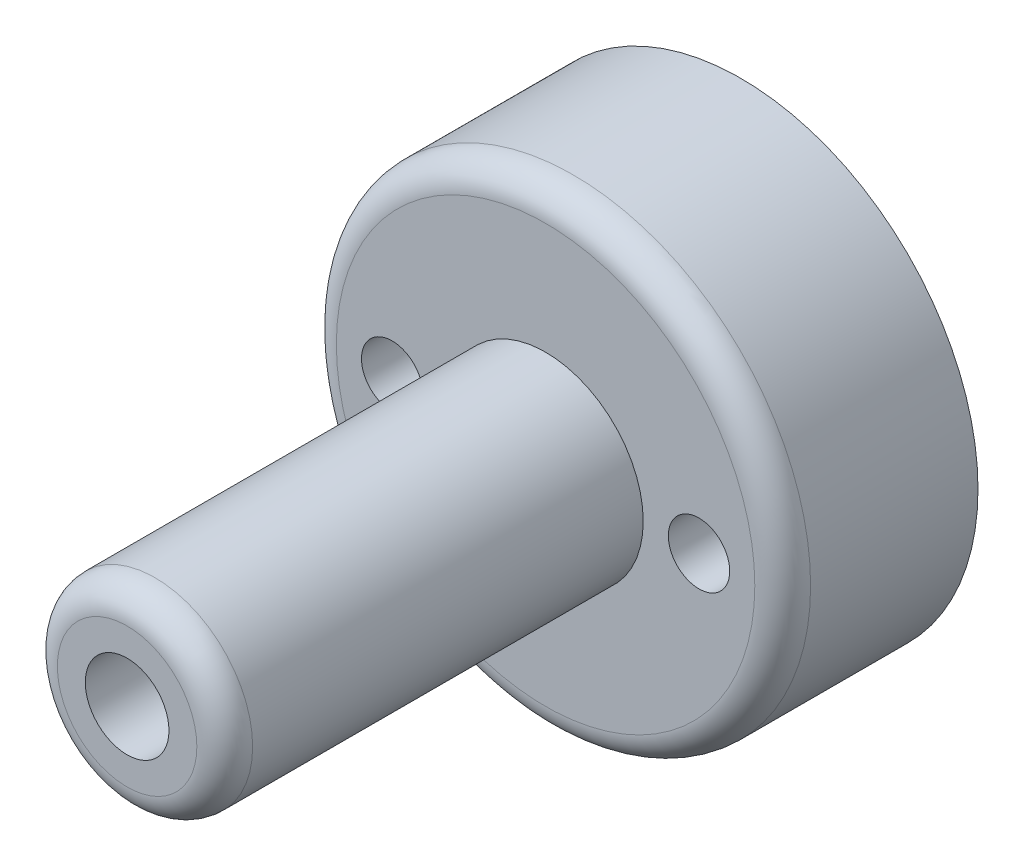
ISO-10303-21;
HEADER;
FILE_DESCRIPTION(('STEP AP214'),'2;1');
FILE_NAME('part.step','',(''),(''),'','','');
FILE_SCHEMA(('AUTOMOTIVE_DESIGN { 1 0 10303 214 1 1 1 1 }'));
ENDSEC;
DATA;
#1=APPLICATION_CONTEXT('core data for automotive mechanical design processes');
#2=APPLICATION_PROTOCOL_DEFINITION('international standard','automotive_design',2000,#1);
#3=PRODUCT_CONTEXT('',#1,'mechanical');
#4=PRODUCT('Part','Part','',(#3));
#5=PRODUCT_RELATED_PRODUCT_CATEGORY('part','',(#4));
#6=PRODUCT_DEFINITION_FORMATION('','',#4);
#7=PRODUCT_DEFINITION_CONTEXT('part definition',#1,'design');
#8=PRODUCT_DEFINITION('design','',#6,#7);
#9=PRODUCT_DEFINITION_SHAPE('','',#8);
#10=(LENGTH_UNIT() NAMED_UNIT(*) SI_UNIT(.MILLI.,.METRE.));
#11=(NAMED_UNIT(*) PLANE_ANGLE_UNIT() SI_UNIT($,.RADIAN.));
#12=(NAMED_UNIT(*) SI_UNIT($,.STERADIAN.) SOLID_ANGLE_UNIT());
#13=UNCERTAINTY_MEASURE_WITH_UNIT(LENGTH_MEASURE(1.E-05),#10,'distance_accuracy_value','');
#14=(GEOMETRIC_REPRESENTATION_CONTEXT(3) GLOBAL_UNCERTAINTY_ASSIGNED_CONTEXT((#13)) GLOBAL_UNIT_ASSIGNED_CONTEXT((#10,
#11,#12)) REPRESENTATION_CONTEXT('',''));
#15=CARTESIAN_POINT('',(0.,0.,0.));
#16=DIRECTION('',(0.,0.,1.));
#17=DIRECTION('',(1.,0.,0.));
#18=AXIS2_PLACEMENT_3D('',#15,#16,#17);
#19=CARTESIAN_POINT('',(0.,0.,7.));
#20=DIRECTION('',(0.,0.,-1.));
#21=DIRECTION('',(-1.,0.,0.));
#22=AXIS2_PLACEMENT_3D('',#19,#20,#21);
#23=CYLINDRICAL_SURFACE('',#22,1.1);
#24=CARTESIAN_POINT('',(0.,0.,7.));
#25=DIRECTION('',(0.,0.,1.));
#26=DIRECTION('',(1.,0.,0.));
#27=AXIS2_PLACEMENT_3D('',#24,#25,#26);
#28=CIRCLE('',#27,1.1);
#29=CARTESIAN_POINT('',(1.1,0.,7.));
#30=VERTEX_POINT('',#29);
#31=EDGE_CURVE('E91',#30,#30,#28,.T.);
#32=ORIENTED_EDGE('',*,*,#31,.T.);
#33=EDGE_LOOP('',(#32));
#34=FACE_BOUND('',#33,.T.);
#35=CARTESIAN_POINT('',(0.,0.,5.3));
#36=DIRECTION('',(0.,0.,-1.));
#37=DIRECTION('',(-1.,0.,0.));
#38=AXIS2_PLACEMENT_3D('',#35,#36,#37);
#39=CIRCLE('',#38,1.1);
#40=CARTESIAN_POINT('',(-1.1,0.,5.3));
#41=VERTEX_POINT('',#40);
#42=EDGE_CURVE('E122',#41,#41,#39,.T.);
#43=ORIENTED_EDGE('',*,*,#42,.T.);
#44=EDGE_LOOP('',(#43));
#45=FACE_BOUND('',#44,.T.);
#46=ADVANCED_FACE('F33',(#34,#45),#23,.F.);
#47=CARTESIAN_POINT('',(5.5,0.,0.));
#48=DIRECTION('',(0.,0.,1.));
#49=DIRECTION('',(1.,0.,0.));
#50=AXIS2_PLACEMENT_3D('',#47,#48,#49);
#51=CYLINDRICAL_SURFACE('',#50,1.1);
#52=CARTESIAN_POINT('',(5.5,0.,7.));
#53=DIRECTION('',(0.,0.,1.));
#54=DIRECTION('',(1.,0.,0.));
#55=AXIS2_PLACEMENT_3D('',#52,#53,#54);
#56=CIRCLE('',#55,1.1);
#57=CARTESIAN_POINT('',(6.6,0.,7.));
#58=VERTEX_POINT('',#57);
#59=EDGE_CURVE('E76',#58,#58,#56,.T.);
#60=ORIENTED_EDGE('',*,*,#59,.T.);
#61=EDGE_LOOP('',(#60));
#62=FACE_BOUND('',#61,.T.);
#63=CARTESIAN_POINT('',(5.5,0.,5.3));
#64=DIRECTION('',(0.,0.,-1.));
#65=DIRECTION('',(-1.,0.,0.));
#66=AXIS2_PLACEMENT_3D('',#63,#64,#65);
#67=CIRCLE('',#66,1.1);
#68=CARTESIAN_POINT('',(4.4,0.,5.3));
#69=VERTEX_POINT('',#68);
#70=EDGE_CURVE('E56',#69,#69,#67,.F.);
#71=ORIENTED_EDGE('',*,*,#70,.F.);
#72=EDGE_LOOP('',(#71));
#73=FACE_BOUND('',#72,.T.);
#74=ADVANCED_FACE('F141',(#62,#73),#51,.F.);
#75=CARTESIAN_POINT('',(-5.5,0.,0.));
#76=DIRECTION('',(0.,0.,1.));
#77=DIRECTION('',(1.,0.,0.));
#78=AXIS2_PLACEMENT_3D('',#75,#76,#77);
#79=CYLINDRICAL_SURFACE('',#78,1.1);
#80=CARTESIAN_POINT('',(-5.5,0.,7.));
#81=DIRECTION('',(0.,0.,1.));
#82=DIRECTION('',(1.,0.,0.));
#83=AXIS2_PLACEMENT_3D('',#80,#81,#82);
#84=CIRCLE('',#83,1.1);
#85=CARTESIAN_POINT('',(-4.4,0.,7.));
#86=VERTEX_POINT('',#85);
#87=EDGE_CURVE('E72',#86,#86,#84,.T.);
#88=ORIENTED_EDGE('',*,*,#87,.T.);
#89=EDGE_LOOP('',(#88));
#90=FACE_BOUND('',#89,.T.);
#91=CARTESIAN_POINT('',(-5.5,0.,5.3));
#92=DIRECTION('',(0.,0.,-1.));
#93=DIRECTION('',(-1.,0.,0.));
#94=AXIS2_PLACEMENT_3D('',#91,#92,#93);
#95=CIRCLE('',#94,1.1);
#96=CARTESIAN_POINT('',(-6.6,0.,5.3));
#97=VERTEX_POINT('',#96);
#98=EDGE_CURVE('E59',#97,#97,#95,.F.);
#99=ORIENTED_EDGE('',*,*,#98,.F.);
#100=EDGE_LOOP('',(#99));
#101=FACE_BOUND('',#100,.T.);
#102=ADVANCED_FACE('F148',(#90,#101),#79,.F.);
#103=CARTESIAN_POINT('',(0.,0.,5.));
#104=DIRECTION('',(0.,0.,1.));
#105=DIRECTION('',(1.,0.,0.));
#106=AXIS2_PLACEMENT_3D('',#103,#104,#105);
#107=PLANE('',#106);
#108=CARTESIAN_POINT('',(0.,0.,5.));
#109=DIRECTION('',(0.,0.,1.));
#110=DIRECTION('',(1.,0.,0.));
#111=AXIS2_PLACEMENT_3D('',#108,#109,#110);
#112=CIRCLE('',#111,1.6);
#113=CARTESIAN_POINT('',(1.6,0.,5.));
#114=VERTEX_POINT('',#113);
#115=EDGE_CURVE('E65',#114,#114,#112,.F.);
#116=ORIENTED_EDGE('',*,*,#115,.F.);
#117=EDGE_LOOP('',(#116));
#118=FACE_BOUND('',#117,.T.);
#119=CARTESIAN_POINT('',(0.,0.,5.));
#120=DIRECTION('',(0.,0.,1.));
#121=DIRECTION('',(1.,0.,0.));
#122=AXIS2_PLACEMENT_3D('',#119,#120,#121);
#123=CIRCLE('',#122,7.55);
#124=CARTESIAN_POINT('',(7.55,0.,5.));
#125=VERTEX_POINT('',#124);
#126=EDGE_CURVE('E88',#125,#125,#123,.T.);
#127=ORIENTED_EDGE('',*,*,#126,.F.);
#128=EDGE_LOOP('',(#127));
#129=FACE_BOUND('',#128,.T.);
#130=CARTESIAN_POINT('',(-5.5,0.,5.));
#131=DIRECTION('',(0.,0.,1.));
#132=DIRECTION('',(1.,0.,0.));
#133=AXIS2_PLACEMENT_3D('',#130,#131,#132);
#134=CIRCLE('',#133,1.6);
#135=CARTESIAN_POINT('',(-3.9,0.,5.));
#136=VERTEX_POINT('',#135);
#137=EDGE_CURVE('E68',#136,#136,#134,.F.);
#138=ORIENTED_EDGE('',*,*,#137,.F.);
#139=EDGE_LOOP('',(#138));
#140=FACE_BOUND('',#139,.T.);
#141=CARTESIAN_POINT('',(5.5,0.,5.));
#142=DIRECTION('',(0.,0.,1.));
#143=DIRECTION('',(1.,0.,0.));
#144=AXIS2_PLACEMENT_3D('',#141,#142,#143);
#145=CIRCLE('',#144,1.6);
#146=CARTESIAN_POINT('',(7.1,0.,5.));
#147=VERTEX_POINT('',#146);
#148=EDGE_CURVE('E62',#147,#147,#145,.F.);
#149=ORIENTED_EDGE('',*,*,#148,.F.);
#150=EDGE_LOOP('',(#149));
#151=FACE_BOUND('',#150,.T.);
#152=ADVANCED_FACE('F185',(#118,#129,#140,#151),#107,.F.);
#153=CARTESIAN_POINT('',(0.,0.,7.));
#154=DIRECTION('',(0.,0.,1.));
#155=DIRECTION('',(1.,0.,0.));
#156=AXIS2_PLACEMENT_3D('',#153,#154,#155);
#157=PLANE('',#156);
#158=ORIENTED_EDGE('',*,*,#31,.F.);
#159=EDGE_LOOP('',(#158));
#160=FACE_BOUND('',#159,.T.);
#161=CARTESIAN_POINT('',(0.,0.,7.));
#162=DIRECTION('',(0.,0.,1.));
#163=DIRECTION('',(1.,0.,0.));
#164=AXIS2_PLACEMENT_3D('',#161,#162,#163);
#165=CIRCLE('',#164,1.5);
#166=CARTESIAN_POINT('',(1.5,0.,7.));
#167=VERTEX_POINT('',#166);
#168=EDGE_CURVE('E71',#167,#167,#165,.F.);
#169=ORIENTED_EDGE('',*,*,#168,.F.);
#170=EDGE_LOOP('',(#169));
#171=FACE_BOUND('',#170,.T.);
#172=ADVANCED_FACE('F166',(#160,#171),#157,.T.);
#173=CARTESIAN_POINT('',(0.,0.,0.));
#174=DIRECTION('',(0.,0.,1.));
#175=DIRECTION('',(1.,0.,0.));
#176=AXIS2_PLACEMENT_3D('',#173,#174,#175);
#177=PLANE('',#176);
#178=CARTESIAN_POINT('',(0.,0.,0.));
#179=DIRECTION('',(0.,0.,1.));
#180=DIRECTION('',(1.,0.,0.));
#181=AXIS2_PLACEMENT_3D('',#178,#179,#180);
#182=CIRCLE('',#181,8.5);
#183=CARTESIAN_POINT('',(8.5,0.,0.));
#184=VERTEX_POINT('',#183);
#185=EDGE_CURVE('E82',#184,#184,#182,.T.);
#186=ORIENTED_EDGE('',*,*,#185,.F.);
#187=EDGE_LOOP('',(#186));
#188=FACE_BOUND('',#187,.T.);
#189=CARTESIAN_POINT('',(0.,0.,0.));
#190=DIRECTION('',(0.,0.,1.));
#191=DIRECTION('',(1.,0.,0.));
#192=AXIS2_PLACEMENT_3D('',#189,#190,#191);
#193=CIRCLE('',#192,7.55);
#194=CARTESIAN_POINT('',(7.55,0.,0.));
#195=VERTEX_POINT('',#194);
#196=EDGE_CURVE('E85',#195,#195,#193,.T.);
#197=ORIENTED_EDGE('',*,*,#196,.T.);
#198=EDGE_LOOP('',(#197));
#199=FACE_BOUND('',#198,.T.);
#200=ADVANCED_FACE('F341',(#188,#199),#177,.F.);
#201=CARTESIAN_POINT('',(0.,0.,5.));
#202=DIRECTION('',(0.,0.,-1.));
#203=DIRECTION('',(-1.,0.,0.));
#204=AXIS2_PLACEMENT_3D('',#201,#202,#203);
#205=CYLINDRICAL_SURFACE('',#204,8.5);
#206=CARTESIAN_POINT('',(0.,0.,6.));
#207=DIRECTION('',(0.,0.,1.));
#208=DIRECTION('',(1.,0.,0.));
#209=AXIS2_PLACEMENT_3D('',#206,#207,#208);
#210=CIRCLE('',#209,8.5);
#211=CARTESIAN_POINT('',(8.5,0.,6.));
#212=VERTEX_POINT('',#211);
#213=EDGE_CURVE('E44',#212,#212,#210,.F.);
#214=ORIENTED_EDGE('',*,*,#213,.T.);
#215=EDGE_LOOP('',(#214));
#216=FACE_BOUND('',#215,.T.);
#217=ORIENTED_EDGE('',*,*,#185,.T.);
#218=EDGE_LOOP('',(#217));
#219=FACE_BOUND('',#218,.T.);
#220=ADVANCED_FACE('F351',(#216,#219),#205,.T.);
#221=CARTESIAN_POINT('',(0.,0.,5.));
#222=DIRECTION('',(0.,0.,-1.));
#223=DIRECTION('',(-1.,0.,0.));
#224=AXIS2_PLACEMENT_3D('',#221,#222,#223);
#225=CYLINDRICAL_SURFACE('',#224,7.55);
#226=ORIENTED_EDGE('',*,*,#126,.T.);
#227=EDGE_LOOP('',(#226));
#228=FACE_BOUND('',#227,.T.);
#229=ORIENTED_EDGE('',*,*,#196,.F.);
#230=EDGE_LOOP('',(#229));
#231=FACE_BOUND('',#230,.T.);
#232=ADVANCED_FACE('F164',(#228,#231),#225,.F.);
#233=CARTESIAN_POINT('',(0.,0.,7.));
#234=DIRECTION('',(0.,0.,1.));
#235=DIRECTION('',(1.,0.,0.));
#236=AXIS2_PLACEMENT_3D('',#233,#234,#235);
#237=CIRCLE('',#236,7.5);
#238=CARTESIAN_POINT('',(7.5,0.,7.));
#239=VERTEX_POINT('',#238);
#240=EDGE_CURVE('E48',#239,#239,#237,.T.);
#241=ORIENTED_EDGE('',*,*,#240,.T.);
#242=EDGE_LOOP('',(#241));
#243=FACE_BOUND('',#242,.T.);
#244=ORIENTED_EDGE('',*,*,#87,.F.);
#245=EDGE_LOOP('',(#244));
#246=FACE_BOUND('',#245,.T.);
#247=ORIENTED_EDGE('',*,*,#59,.F.);
#248=EDGE_LOOP('',(#247));
#249=FACE_BOUND('',#248,.T.);
#250=CARTESIAN_POINT('',(0.,0.,7.));
#251=DIRECTION('',(0.,0.,1.));
#252=DIRECTION('',(1.,0.,0.));
#253=AXIS2_PLACEMENT_3D('',#250,#251,#252);
#254=CIRCLE('',#253,3.5);
#255=CARTESIAN_POINT('',(3.5,0.,7.));
#256=VERTEX_POINT('',#255);
#257=EDGE_CURVE('E75',#256,#256,#254,.T.);
#258=ORIENTED_EDGE('',*,*,#257,.F.);
#259=EDGE_LOOP('',(#258));
#260=FACE_BOUND('',#259,.T.);
#261=ADVANCED_FACE('F156',(#243,#246,#249,#260),#157,.T.);
#262=CARTESIAN_POINT('',(0.,0.,5.));
#263=DIRECTION('',(0.,0.,-1.));
#264=DIRECTION('',(-1.,0.,0.));
#265=AXIS2_PLACEMENT_3D('',#262,#263,#264);
#266=CIRCLE('',#265,1.1);
#267=CARTESIAN_POINT('',(-1.1,0.,5.));
#268=VERTEX_POINT('',#267);
#269=EDGE_CURVE('E53',#268,#268,#266,.T.);
#270=ORIENTED_EDGE('',*,*,#269,.F.);
#271=EDGE_LOOP('',(#270));
#272=FACE_BOUND('',#271,.T.);
#273=CARTESIAN_POINT('',(0.,0.,0.));
#274=DIRECTION('',(0.,0.,1.));
#275=DIRECTION('',(1.,0.,0.));
#276=AXIS2_PLACEMENT_3D('',#273,#274,#275);
#277=CIRCLE('',#276,1.1);
#278=CARTESIAN_POINT('',(1.1,0.,0.));
#279=VERTEX_POINT('',#278);
#280=EDGE_CURVE('E104',#279,#279,#277,.T.);
#281=ORIENTED_EDGE('',*,*,#280,.F.);
#282=EDGE_LOOP('',(#281));
#283=FACE_BOUND('',#282,.T.);
#284=ADVANCED_FACE('F144',(#272,#283),#23,.F.);
#285=CARTESIAN_POINT('',(0.,0.,22.));
#286=DIRECTION('',(0.,0.,-1.));
#287=DIRECTION('',(-1.,0.,0.));
#288=AXIS2_PLACEMENT_3D('',#285,#286,#287);
#289=CYLINDRICAL_SURFACE('',#288,1.5);
#290=CARTESIAN_POINT('',(0.,0.,22.));
#291=DIRECTION('',(0.,0.,1.));
#292=DIRECTION('',(1.,0.,0.));
#293=AXIS2_PLACEMENT_3D('',#290,#291,#292);
#294=CIRCLE('',#293,1.5);
#295=CARTESIAN_POINT('',(1.5,0.,22.));
#296=VERTEX_POINT('',#295);
#297=EDGE_CURVE('E94',#296,#296,#294,.T.);
#298=ORIENTED_EDGE('',*,*,#297,.T.);
#299=EDGE_LOOP('',(#298));
#300=FACE_BOUND('',#299,.T.);
#301=ORIENTED_EDGE('',*,*,#168,.T.);
#302=EDGE_LOOP('',(#301));
#303=FACE_BOUND('',#302,.T.);
#304=ADVANCED_FACE('F155',(#300,#303),#289,.F.);
#305=CARTESIAN_POINT('',(0.,0.,22.));
#306=DIRECTION('',(0.,0.,-1.));
#307=DIRECTION('',(-1.,0.,0.));
#308=AXIS2_PLACEMENT_3D('',#305,#306,#307);
#309=CYLINDRICAL_SURFACE('',#308,3.5);
#310=CARTESIAN_POINT('',(0.,0.,21.));
#311=DIRECTION('',(0.,0.,1.));
#312=DIRECTION('',(1.,0.,0.));
#313=AXIS2_PLACEMENT_3D('',#310,#311,#312);
#314=CIRCLE('',#313,3.5);
#315=CARTESIAN_POINT('',(3.5,0.,21.));
#316=VERTEX_POINT('',#315);
#317=EDGE_CURVE('E10',#316,#316,#314,.F.);
#318=ORIENTED_EDGE('',*,*,#317,.T.);
#319=EDGE_LOOP('',(#318));
#320=FACE_BOUND('',#319,.T.);
#321=ORIENTED_EDGE('',*,*,#257,.T.);
#322=EDGE_LOOP('',(#321));
#323=FACE_BOUND('',#322,.T.);
#324=ADVANCED_FACE('F162',(#320,#323),#309,.T.);
#325=CARTESIAN_POINT('',(0.,0.,22.));
#326=DIRECTION('',(0.,0.,1.));
#327=DIRECTION('',(1.,0.,0.));
#328=AXIS2_PLACEMENT_3D('',#325,#326,#327);
#329=PLANE('',#328);
#330=CARTESIAN_POINT('',(0.,0.,22.));
#331=DIRECTION('',(0.,0.,1.));
#332=DIRECTION('',(1.,0.,0.));
#333=AXIS2_PLACEMENT_3D('',#330,#331,#332);
#334=CIRCLE('',#333,2.5);
#335=CARTESIAN_POINT('',(2.5,0.,22.));
#336=VERTEX_POINT('',#335);
#337=EDGE_CURVE('E40',#336,#336,#334,.T.);
#338=ORIENTED_EDGE('',*,*,#337,.T.);
#339=EDGE_LOOP('',(#338));
#340=FACE_BOUND('',#339,.T.);
#341=ORIENTED_EDGE('',*,*,#297,.F.);
#342=EDGE_LOOP('',(#341));
#343=FACE_BOUND('',#342,.T.);
#344=ADVANCED_FACE('F220',(#340,#343),#329,.T.);
#345=CARTESIAN_POINT('',(5.5,0.,5.));
#346=DIRECTION('',(0.,0.,-1.));
#347=DIRECTION('',(-1.,0.,0.));
#348=AXIS2_PLACEMENT_3D('',#345,#346,#347);
#349=CIRCLE('',#348,1.1);
#350=CARTESIAN_POINT('',(4.4,0.,5.));
#351=VERTEX_POINT('',#350);
#352=EDGE_CURVE('E119',#351,#351,#349,.T.);
#353=ORIENTED_EDGE('',*,*,#352,.F.);
#354=EDGE_LOOP('',(#353));
#355=FACE_BOUND('',#354,.T.);
#356=CARTESIAN_POINT('',(5.5,0.,0.));
#357=DIRECTION('',(0.,0.,1.));
#358=DIRECTION('',(1.,0.,0.));
#359=AXIS2_PLACEMENT_3D('',#356,#357,#358);
#360=CIRCLE('',#359,1.1);
#361=CARTESIAN_POINT('',(6.6,0.,0.));
#362=VERTEX_POINT('',#361);
#363=EDGE_CURVE('E110',#362,#362,#360,.T.);
#364=ORIENTED_EDGE('',*,*,#363,.F.);
#365=EDGE_LOOP('',(#364));
#366=FACE_BOUND('',#365,.T.);
#367=ADVANCED_FACE('F151',(#355,#366),#51,.F.);
#368=CARTESIAN_POINT('',(-5.5,0.,5.));
#369=DIRECTION('',(0.,0.,-1.));
#370=DIRECTION('',(-1.,0.,0.));
#371=AXIS2_PLACEMENT_3D('',#368,#369,#370);
#372=CIRCLE('',#371,1.1);
#373=CARTESIAN_POINT('',(-6.6,0.,5.));
#374=VERTEX_POINT('',#373);
#375=EDGE_CURVE('E116',#374,#374,#372,.T.);
#376=ORIENTED_EDGE('',*,*,#375,.F.);
#377=EDGE_LOOP('',(#376));
#378=FACE_BOUND('',#377,.T.);
#379=CARTESIAN_POINT('',(-5.5,0.,0.));
#380=DIRECTION('',(0.,0.,1.));
#381=DIRECTION('',(1.,0.,0.));
#382=AXIS2_PLACEMENT_3D('',#379,#380,#381);
#383=CIRCLE('',#382,1.1);
#384=CARTESIAN_POINT('',(-4.4,0.,0.));
#385=VERTEX_POINT('',#384);
#386=EDGE_CURVE('E79',#385,#385,#383,.T.);
#387=ORIENTED_EDGE('',*,*,#386,.F.);
#388=EDGE_LOOP('',(#387));
#389=FACE_BOUND('',#388,.T.);
#390=ADVANCED_FACE('F211',(#378,#389),#79,.F.);
#391=CARTESIAN_POINT('',(-5.5,0.,-4.52548339959391));
#392=DIRECTION('',(0.,0.,1.));
#393=DIRECTION('',(1.,0.,0.));
#394=AXIS2_PLACEMENT_3D('',#391,#392,#393);
#395=CYLINDRICAL_SURFACE('',#394,1.6);
#396=CARTESIAN_POINT('',(-5.5,0.,0.));
#397=DIRECTION('',(0.,0.,1.));
#398=DIRECTION('',(1.,0.,0.));
#399=AXIS2_PLACEMENT_3D('',#396,#397,#398);
#400=CIRCLE('',#399,1.6);
#401=CARTESIAN_POINT('',(-3.9,0.,0.));
#402=VERTEX_POINT('',#401);
#403=EDGE_CURVE('E101',#402,#402,#400,.T.);
#404=ORIENTED_EDGE('',*,*,#403,.T.);
#405=EDGE_LOOP('',(#404));
#406=FACE_BOUND('',#405,.T.);
#407=ORIENTED_EDGE('',*,*,#137,.T.);
#408=EDGE_LOOP('',(#407));
#409=FACE_BOUND('',#408,.T.);
#410=ADVANCED_FACE('F208',(#406,#409),#395,.T.);
#411=CARTESIAN_POINT('',(0.,0.,0.));
#412=DIRECTION('',(0.,0.,1.));
#413=DIRECTION('',(1.,0.,0.));
#414=AXIS2_PLACEMENT_3D('',#411,#412,#413);
#415=PLANE('',#414);
#416=ORIENTED_EDGE('',*,*,#386,.T.);
#417=EDGE_LOOP('',(#416));
#418=FACE_BOUND('',#417,.T.);
#419=ORIENTED_EDGE('',*,*,#403,.F.);
#420=EDGE_LOOP('',(#419));
#421=FACE_BOUND('',#420,.T.);
#422=ADVANCED_FACE('F181',(#418,#421),#415,.F.);
#423=CARTESIAN_POINT('',(0.,0.,-4.52548339959391));
#424=DIRECTION('',(0.,0.,1.));
#425=DIRECTION('',(1.,0.,0.));
#426=AXIS2_PLACEMENT_3D('',#423,#424,#425);
#427=CYLINDRICAL_SURFACE('',#426,1.6);
#428=CARTESIAN_POINT('',(0.,0.,0.));
#429=DIRECTION('',(0.,0.,1.));
#430=DIRECTION('',(1.,0.,0.));
#431=AXIS2_PLACEMENT_3D('',#428,#429,#430);
#432=CIRCLE('',#431,1.6);
#433=CARTESIAN_POINT('',(1.6,0.,0.));
#434=VERTEX_POINT('',#433);
#435=EDGE_CURVE('E107',#434,#434,#432,.T.);
#436=ORIENTED_EDGE('',*,*,#435,.T.);
#437=EDGE_LOOP('',(#436));
#438=FACE_BOUND('',#437,.T.);
#439=ORIENTED_EDGE('',*,*,#115,.T.);
#440=EDGE_LOOP('',(#439));
#441=FACE_BOUND('',#440,.T.);
#442=ADVANCED_FACE('F175',(#438,#441),#427,.T.);
#443=CARTESIAN_POINT('',(0.,0.,0.));
#444=DIRECTION('',(0.,0.,1.));
#445=DIRECTION('',(1.,0.,0.));
#446=AXIS2_PLACEMENT_3D('',#443,#444,#445);
#447=PLANE('',#446);
#448=ORIENTED_EDGE('',*,*,#280,.T.);
#449=EDGE_LOOP('',(#448));
#450=FACE_BOUND('',#449,.T.);
#451=ORIENTED_EDGE('',*,*,#435,.F.);
#452=EDGE_LOOP('',(#451));
#453=FACE_BOUND('',#452,.T.);
#454=ADVANCED_FACE('F171',(#450,#453),#447,.F.);
#455=CARTESIAN_POINT('',(5.5,0.,-4.52548339959391));
#456=DIRECTION('',(0.,0.,1.));
#457=DIRECTION('',(1.,0.,0.));
#458=AXIS2_PLACEMENT_3D('',#455,#456,#457);
#459=CYLINDRICAL_SURFACE('',#458,1.6);
#460=CARTESIAN_POINT('',(5.5,0.,0.));
#461=DIRECTION('',(0.,0.,1.));
#462=DIRECTION('',(1.,0.,0.));
#463=AXIS2_PLACEMENT_3D('',#460,#461,#462);
#464=CIRCLE('',#463,1.6);
#465=CARTESIAN_POINT('',(7.1,0.,0.));
#466=VERTEX_POINT('',#465);
#467=EDGE_CURVE('E113',#466,#466,#464,.T.);
#468=ORIENTED_EDGE('',*,*,#467,.T.);
#469=EDGE_LOOP('',(#468));
#470=FACE_BOUND('',#469,.T.);
#471=ORIENTED_EDGE('',*,*,#148,.T.);
#472=EDGE_LOOP('',(#471));
#473=FACE_BOUND('',#472,.T.);
#474=ADVANCED_FACE('F174',(#470,#473),#459,.T.);
#475=CARTESIAN_POINT('',(0.,0.,0.));
#476=DIRECTION('',(0.,0.,1.));
#477=DIRECTION('',(1.,0.,0.));
#478=AXIS2_PLACEMENT_3D('',#475,#476,#477);
#479=PLANE('',#478);
#480=ORIENTED_EDGE('',*,*,#363,.T.);
#481=EDGE_LOOP('',(#480));
#482=FACE_BOUND('',#481,.T.);
#483=ORIENTED_EDGE('',*,*,#467,.F.);
#484=EDGE_LOOP('',(#483));
#485=FACE_BOUND('',#484,.T.);
#486=ADVANCED_FACE('F196',(#482,#485),#479,.F.);
#487=CARTESIAN_POINT('',(-5.5,0.,5.));
#488=DIRECTION('',(0.,0.,-1.));
#489=DIRECTION('',(-1.,0.,0.));
#490=AXIS2_PLACEMENT_3D('',#487,#488,#489);
#491=PLANE('',#490);
#492=ORIENTED_EDGE('',*,*,#375,.T.);
#493=EDGE_LOOP('',(#492));
#494=FACE_BOUND('',#493,.T.);
#495=ADVANCED_FACE('F202',(#494),#491,.T.);
#496=CARTESIAN_POINT('',(-5.5,0.,5.3));
#497=DIRECTION('',(0.,0.,-1.));
#498=DIRECTION('',(-1.,0.,0.));
#499=AXIS2_PLACEMENT_3D('',#496,#497,#498);
#500=PLANE('',#499);
#501=ORIENTED_EDGE('',*,*,#98,.T.);
#502=EDGE_LOOP('',(#501));
#503=FACE_BOUND('',#502,.T.);
#504=ADVANCED_FACE('F404',(#503),#500,.F.);
#505=CARTESIAN_POINT('',(5.5,0.,5.));
#506=DIRECTION('',(0.,0.,-1.));
#507=DIRECTION('',(-1.,0.,0.));
#508=AXIS2_PLACEMENT_3D('',#505,#506,#507);
#509=PLANE('',#508);
#510=ORIENTED_EDGE('',*,*,#352,.T.);
#511=EDGE_LOOP('',(#510));
#512=FACE_BOUND('',#511,.T.);
#513=ADVANCED_FACE('F394',(#512),#509,.T.);
#514=CARTESIAN_POINT('',(5.5,0.,5.3));
#515=DIRECTION('',(0.,0.,-1.));
#516=DIRECTION('',(-1.,0.,0.));
#517=AXIS2_PLACEMENT_3D('',#514,#515,#516);
#518=PLANE('',#517);
#519=ORIENTED_EDGE('',*,*,#70,.T.);
#520=EDGE_LOOP('',(#519));
#521=FACE_BOUND('',#520,.T.);
#522=ADVANCED_FACE('F137',(#521),#518,.F.);
#523=CARTESIAN_POINT('',(0.,0.,5.));
#524=DIRECTION('',(0.,0.,-1.));
#525=DIRECTION('',(-1.,0.,0.));
#526=AXIS2_PLACEMENT_3D('',#523,#524,#525);
#527=PLANE('',#526);
#528=ORIENTED_EDGE('',*,*,#269,.T.);
#529=EDGE_LOOP('',(#528));
#530=FACE_BOUND('',#529,.T.);
#531=ADVANCED_FACE('F130',(#530),#527,.T.);
#532=CARTESIAN_POINT('',(0.,0.,5.3));
#533=DIRECTION('',(0.,0.,-1.));
#534=DIRECTION('',(-1.,0.,0.));
#535=AXIS2_PLACEMENT_3D('',#532,#533,#534);
#536=PLANE('',#535);
#537=ORIENTED_EDGE('',*,*,#42,.F.);
#538=EDGE_LOOP('',(#537));
#539=FACE_BOUND('',#538,.T.);
#540=ADVANCED_FACE('F127',(#539),#536,.F.);
#541=CARTESIAN_POINT('',(0.,0.,6.));
#542=DIRECTION('',(0.,0.,1.));
#543=DIRECTION('',(1.,0.,0.));
#544=AXIS2_PLACEMENT_3D('',#541,#542,#543);
#545=TOROIDAL_SURFACE('',#544,7.5,1.);
#546=ORIENTED_EDGE('',*,*,#213,.F.);
#547=EDGE_LOOP('',(#546));
#548=FACE_BOUND('',#547,.T.);
#549=ORIENTED_EDGE('',*,*,#240,.F.);
#550=EDGE_LOOP('',(#549));
#551=FACE_BOUND('',#550,.T.);
#552=ADVANCED_FACE('F129',(#548,#551),#545,.T.);
#553=CARTESIAN_POINT('',(0.,0.,21.));
#554=DIRECTION('',(0.,0.,1.));
#555=DIRECTION('',(1.,0.,0.));
#556=AXIS2_PLACEMENT_3D('',#553,#554,#555);
#557=TOROIDAL_SURFACE('',#556,2.5,1.);
#558=ORIENTED_EDGE('',*,*,#317,.F.);
#559=EDGE_LOOP('',(#558));
#560=FACE_BOUND('',#559,.T.);
#561=ORIENTED_EDGE('',*,*,#337,.F.);
#562=EDGE_LOOP('',(#561));
#563=FACE_BOUND('',#562,.T.);
#564=ADVANCED_FACE('F35',(#560,#563),#557,.T.);
#565=CLOSED_SHELL('',(#46,#74,#102,#152,#172,#200,#220,#232,#261,#284,#304,#324,#344,#367,#390,
#410,#422,#442,#454,#474,#486,#495,#504,#513,#522,#531,#540,#552,#564));
#566=MANIFOLD_SOLID_BREP('B2',#565);
#567=ADVANCED_BREP_SHAPE_REPRESENTATION('',(#18,#566),#14);
#568=SHAPE_DEFINITION_REPRESENTATION(#9,#567);
ENDSEC;
END-ISO-10303-21;
